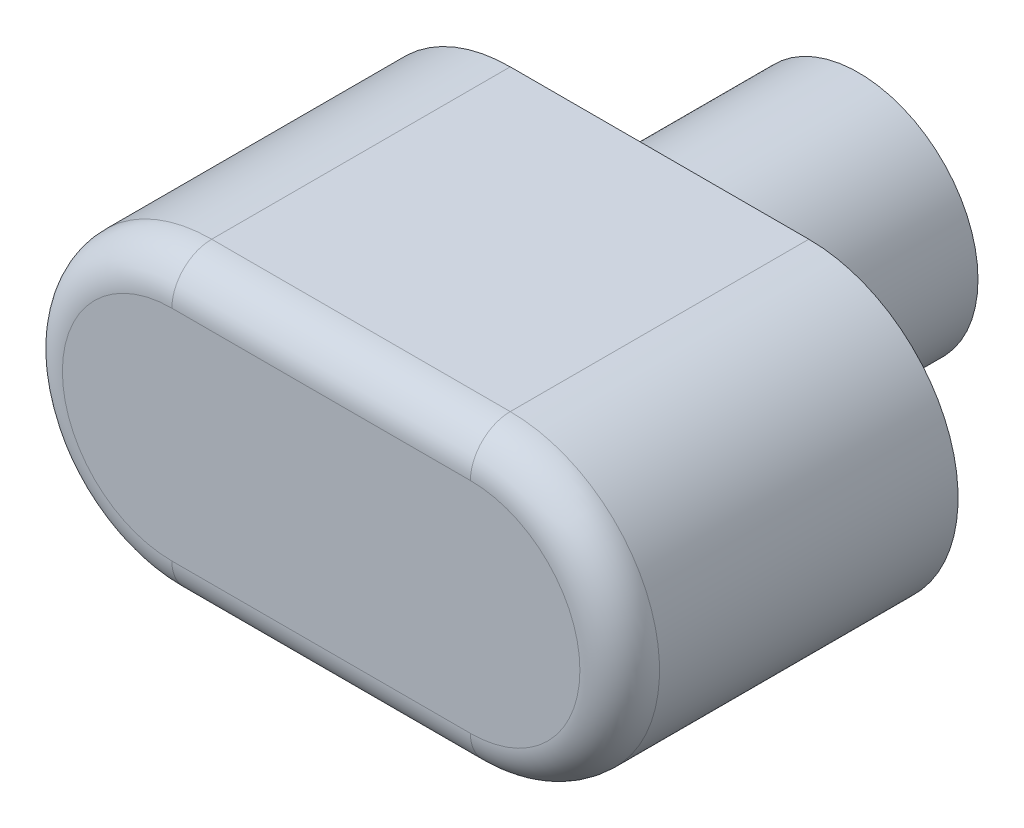
ISO-10303-21;
HEADER;
FILE_DESCRIPTION(('STEP AP214'),'2;1');
FILE_NAME('part.step','',(''),(''),'','','');
FILE_SCHEMA(('AUTOMOTIVE_DESIGN { 1 0 10303 214 1 1 1 1 }'));
ENDSEC;
DATA;
#1=APPLICATION_CONTEXT('core data for automotive mechanical design processes');
#2=APPLICATION_PROTOCOL_DEFINITION('international standard','automotive_design',2000,#1);
#3=PRODUCT_CONTEXT('',#1,'mechanical');
#4=PRODUCT('Part','Part','',(#3));
#5=PRODUCT_RELATED_PRODUCT_CATEGORY('part','',(#4));
#6=PRODUCT_DEFINITION_FORMATION('','',#4);
#7=PRODUCT_DEFINITION_CONTEXT('part definition',#1,'design');
#8=PRODUCT_DEFINITION('design','',#6,#7);
#9=PRODUCT_DEFINITION_SHAPE('','',#8);
#10=(LENGTH_UNIT() NAMED_UNIT(*) SI_UNIT(.MILLI.,.METRE.));
#11=(NAMED_UNIT(*) PLANE_ANGLE_UNIT() SI_UNIT($,.RADIAN.));
#12=(NAMED_UNIT(*) SI_UNIT($,.STERADIAN.) SOLID_ANGLE_UNIT());
#13=UNCERTAINTY_MEASURE_WITH_UNIT(LENGTH_MEASURE(1.E-05),#10,'distance_accuracy_value','');
#14=(GEOMETRIC_REPRESENTATION_CONTEXT(3) GLOBAL_UNCERTAINTY_ASSIGNED_CONTEXT((#13)) GLOBAL_UNIT_ASSIGNED_CONTEXT((#10,
#11,#12)) REPRESENTATION_CONTEXT('',''));
#15=CARTESIAN_POINT('',(0.,0.,0.));
#16=DIRECTION('',(0.,0.,1.));
#17=DIRECTION('',(1.,0.,0.));
#18=AXIS2_PLACEMENT_3D('',#15,#16,#17);
#19=CARTESIAN_POINT('',(-7.5,7.5,17.));
#20=DIRECTION('',(0.,0.,1.));
#21=DIRECTION('',(1.,0.,0.));
#22=AXIS2_PLACEMENT_3D('',#19,#20,#21);
#23=PLANE('',#22);
#24=DIRECTION('',(1.,0.,0.));
#25=VECTOR('',#24,1.);
#26=CARTESIAN_POINT('',(-11.25,13.,17.));
#27=LINE('',#26,#25);
#28=CARTESIAN_POINT('',(-15.,13.,17.));
#29=VERTEX_POINT('',#28);
#30=CARTESIAN_POINT('',(0.,13.,17.));
#31=VERTEX_POINT('',#30);
#32=EDGE_CURVE('E84',#29,#31,#27,.T.);
#33=ORIENTED_EDGE('',*,*,#32,.F.);
#34=CARTESIAN_POINT('',(-15.,7.5,17.));
#35=DIRECTION('',(0.,0.,-1.));
#36=DIRECTION('',(0.,-1.,0.));
#37=AXIS2_PLACEMENT_3D('',#34,#35,#36);
#38=CIRCLE('',#37,5.5);
#39=CARTESIAN_POINT('',(-15.,2.,17.));
#40=VERTEX_POINT('',#39);
#41=EDGE_CURVE('E104',#40,#29,#38,.T.);
#42=ORIENTED_EDGE('',*,*,#41,.F.);
#43=DIRECTION('',(-1.,0.,0.));
#44=VECTOR('',#43,1.);
#45=CARTESIAN_POINT('',(-3.75,2.,17.));
#46=LINE('',#45,#44);
#47=CARTESIAN_POINT('',(0.,2.,17.));
#48=VERTEX_POINT('',#47);
#49=EDGE_CURVE('E87',#48,#40,#46,.T.);
#50=ORIENTED_EDGE('',*,*,#49,.F.);
#51=CARTESIAN_POINT('',(0.,7.5,17.));
#52=DIRECTION('',(0.,0.,-1.));
#53=DIRECTION('',(0.,1.,0.));
#54=AXIS2_PLACEMENT_3D('',#51,#52,#53);
#55=CIRCLE('',#54,5.5);
#56=EDGE_CURVE('E80',#31,#48,#55,.T.);
#57=ORIENTED_EDGE('',*,*,#56,.F.);
#58=EDGE_LOOP('',(#33,#42,#50,#57));
#59=FACE_BOUND('',#58,.T.);
#60=ADVANCED_FACE('F17',(#59),#23,.T.);
#61=CARTESIAN_POINT('',(0.,7.5,15.));
#62=DIRECTION('',(0.,0.,-1.));
#63=DIRECTION('',(-1.,0.,0.));
#64=AXIS2_PLACEMENT_3D('',#61,#62,#63);
#65=TOROIDAL_SURFACE('',#64,5.5,2.);
#66=CARTESIAN_POINT('',(0.,2.,15.));
#67=DIRECTION('',(-1.,0.,0.));
#68=DIRECTION('',(0.,-1.,0.));
#69=AXIS2_PLACEMENT_3D('',#66,#67,#68);
#70=CIRCLE('',#69,2.);
#71=CARTESIAN_POINT('',(0.,0.,15.));
#72=VERTEX_POINT('',#71);
#73=EDGE_CURVE('E131',#72,#48,#70,.T.);
#74=ORIENTED_EDGE('',*,*,#73,.F.);
#75=CARTESIAN_POINT('',(0.,7.5,15.));
#76=DIRECTION('',(0.,0.,1.));
#77=DIRECTION('',(1.,0.,0.));
#78=AXIS2_PLACEMENT_3D('',#75,#76,#77);
#79=CIRCLE('',#78,7.5);
#80=CARTESIAN_POINT('',(0.,15.,15.));
#81=VERTEX_POINT('',#80);
#82=EDGE_CURVE('E96',#81,#72,#79,.F.);
#83=ORIENTED_EDGE('',*,*,#82,.F.);
#84=CARTESIAN_POINT('',(0.,13.,15.));
#85=DIRECTION('',(1.,0.,0.));
#86=DIRECTION('',(0.,0.,-1.));
#87=AXIS2_PLACEMENT_3D('',#84,#85,#86);
#88=CIRCLE('',#87,2.);
#89=EDGE_CURVE('E91',#31,#81,#88,.F.);
#90=ORIENTED_EDGE('',*,*,#89,.F.);
#91=ORIENTED_EDGE('',*,*,#56,.T.);
#92=EDGE_LOOP('',(#74,#83,#90,#91));
#93=FACE_BOUND('',#92,.T.);
#94=ADVANCED_FACE('F95',(#93),#65,.T.);
#95=CARTESIAN_POINT('',(-11.25,13.,15.));
#96=DIRECTION('',(1.,0.,0.));
#97=DIRECTION('',(0.,0.,-1.));
#98=AXIS2_PLACEMENT_3D('',#95,#96,#97);
#99=CYLINDRICAL_SURFACE('',#98,2.);
#100=CARTESIAN_POINT('',(-15.,13.,15.));
#101=DIRECTION('',(1.,0.,0.));
#102=DIRECTION('',(0.,1.,0.));
#103=AXIS2_PLACEMENT_3D('',#100,#101,#102);
#104=CIRCLE('',#103,2.);
#105=CARTESIAN_POINT('',(-15.,15.,15.));
#106=VERTEX_POINT('',#105);
#107=EDGE_CURVE('E101',#29,#106,#104,.F.);
#108=ORIENTED_EDGE('',*,*,#107,.F.);
#109=ORIENTED_EDGE('',*,*,#32,.T.);
#110=ORIENTED_EDGE('',*,*,#89,.T.);
#111=DIRECTION('',(1.,0.,0.));
#112=VECTOR('',#111,1.);
#113=CARTESIAN_POINT('',(-15.,15.,15.));
#114=LINE('',#113,#112);
#115=EDGE_CURVE('E145',#106,#81,#114,.T.);
#116=ORIENTED_EDGE('',*,*,#115,.F.);
#117=EDGE_LOOP('',(#108,#109,#110,#116));
#118=FACE_BOUND('',#117,.T.);
#119=ADVANCED_FACE('F100',(#118),#99,.T.);
#120=CARTESIAN_POINT('',(-15.,7.5,15.));
#121=DIRECTION('',(0.,0.,-1.));
#122=DIRECTION('',(-1.,0.,0.));
#123=AXIS2_PLACEMENT_3D('',#120,#121,#122);
#124=TOROIDAL_SURFACE('',#123,5.5,2.);
#125=CARTESIAN_POINT('',(-15.,2.,15.));
#126=DIRECTION('',(-1.,0.,0.));
#127=DIRECTION('',(0.,-1.,0.));
#128=AXIS2_PLACEMENT_3D('',#125,#126,#127);
#129=CIRCLE('',#128,2.);
#130=CARTESIAN_POINT('',(-15.,0.,15.));
#131=VERTEX_POINT('',#130);
#132=EDGE_CURVE('E130',#40,#131,#129,.F.);
#133=ORIENTED_EDGE('',*,*,#132,.F.);
#134=ORIENTED_EDGE('',*,*,#41,.T.);
#135=ORIENTED_EDGE('',*,*,#107,.T.);
#136=CARTESIAN_POINT('',(-15.,7.5,15.));
#137=DIRECTION('',(0.,0.,1.));
#138=DIRECTION('',(1.,0.,0.));
#139=AXIS2_PLACEMENT_3D('',#136,#137,#138);
#140=CIRCLE('',#139,7.5);
#141=EDGE_CURVE('E57',#131,#106,#140,.F.);
#142=ORIENTED_EDGE('',*,*,#141,.F.);
#143=EDGE_LOOP('',(#133,#134,#135,#142));
#144=FACE_BOUND('',#143,.T.);
#145=ADVANCED_FACE('F153',(#144),#124,.T.);
#146=CARTESIAN_POINT('',(-3.75,2.,15.));
#147=DIRECTION('',(-1.,0.,0.));
#148=DIRECTION('',(0.,-1.,0.));
#149=AXIS2_PLACEMENT_3D('',#146,#147,#148);
#150=CYLINDRICAL_SURFACE('',#149,2.);
#151=ORIENTED_EDGE('',*,*,#132,.T.);
#152=DIRECTION('',(1.,0.,0.));
#153=VECTOR('',#152,1.);
#154=CARTESIAN_POINT('',(0.,0.,15.));
#155=LINE('',#154,#153);
#156=EDGE_CURVE('E202',#72,#131,#155,.F.);
#157=ORIENTED_EDGE('',*,*,#156,.F.);
#158=ORIENTED_EDGE('',*,*,#73,.T.);
#159=ORIENTED_EDGE('',*,*,#49,.T.);
#160=EDGE_LOOP('',(#151,#157,#158,#159));
#161=FACE_BOUND('',#160,.T.);
#162=ADVANCED_FACE('F157',(#161),#150,.T.);
#163=CARTESIAN_POINT('',(0.,7.5,0.));
#164=DIRECTION('',(0.,0.,1.));
#165=DIRECTION('',(1.,0.,0.));
#166=AXIS2_PLACEMENT_3D('',#163,#164,#165);
#167=CYLINDRICAL_SURFACE('',#166,7.5);
#168=CARTESIAN_POINT('',(0.,7.5,0.));
#169=DIRECTION('',(0.,0.,1.));
#170=DIRECTION('',(1.,0.,0.));
#171=AXIS2_PLACEMENT_3D('',#168,#169,#170);
#172=CIRCLE('',#171,7.5);
#173=CARTESIAN_POINT('',(0.,0.,0.));
#174=VERTEX_POINT('',#173);
#175=CARTESIAN_POINT('',(0.,15.,0.));
#176=VERTEX_POINT('',#175);
#177=EDGE_CURVE('E21',#174,#176,#172,.T.);
#178=ORIENTED_EDGE('',*,*,#177,.T.);
#179=DIRECTION('',(0.,0.,1.));
#180=VECTOR('',#179,1.);
#181=CARTESIAN_POINT('',(0.,15.,0.));
#182=LINE('',#181,#180);
#183=EDGE_CURVE('E148',#81,#176,#182,.F.);
#184=ORIENTED_EDGE('',*,*,#183,.F.);
#185=ORIENTED_EDGE('',*,*,#82,.T.);
#186=DIRECTION('',(0.,0.,-1.));
#187=VECTOR('',#186,1.);
#188=CARTESIAN_POINT('',(0.,0.,0.));
#189=LINE('',#188,#187);
#190=EDGE_CURVE('E48',#174,#72,#189,.F.);
#191=ORIENTED_EDGE('',*,*,#190,.F.);
#192=EDGE_LOOP('',(#178,#184,#185,#191));
#193=FACE_BOUND('',#192,.T.);
#194=ADVANCED_FACE('F160',(#193),#167,.T.);
#195=CARTESIAN_POINT('',(-15.,15.,0.));
#196=DIRECTION('',(0.,1.,0.));
#197=DIRECTION('',(0.,0.,1.));
#198=AXIS2_PLACEMENT_3D('',#195,#196,#197);
#199=PLANE('',#198);
#200=DIRECTION('',(1.,0.,0.));
#201=VECTOR('',#200,1.);
#202=CARTESIAN_POINT('',(-7.5,15.,0.));
#203=LINE('',#202,#201);
#204=CARTESIAN_POINT('',(-15.,15.,0.));
#205=VERTEX_POINT('',#204);
#206=EDGE_CURVE('E194',#176,#205,#203,.F.);
#207=ORIENTED_EDGE('',*,*,#206,.T.);
#208=DIRECTION('',(0.,0.,1.));
#209=VECTOR('',#208,1.);
#210=CARTESIAN_POINT('',(-15.,15.,0.));
#211=LINE('',#210,#209);
#212=EDGE_CURVE('E208',#106,#205,#211,.F.);
#213=ORIENTED_EDGE('',*,*,#212,.F.);
#214=ORIENTED_EDGE('',*,*,#115,.T.);
#215=ORIENTED_EDGE('',*,*,#183,.T.);
#216=EDGE_LOOP('',(#207,#213,#214,#215));
#217=FACE_BOUND('',#216,.T.);
#218=ADVANCED_FACE('F163',(#217),#199,.T.);
#219=CARTESIAN_POINT('',(-15.,7.5,0.));
#220=DIRECTION('',(0.,0.,1.));
#221=DIRECTION('',(1.,0.,0.));
#222=AXIS2_PLACEMENT_3D('',#219,#220,#221);
#223=CYLINDRICAL_SURFACE('',#222,7.5);
#224=CARTESIAN_POINT('',(-15.,7.5,0.));
#225=DIRECTION('',(0.,0.,1.));
#226=DIRECTION('',(1.,0.,0.));
#227=AXIS2_PLACEMENT_3D('',#224,#225,#226);
#228=CIRCLE('',#227,7.5);
#229=CARTESIAN_POINT('',(-15.,0.,0.));
#230=VERTEX_POINT('',#229);
#231=EDGE_CURVE('E36',#205,#230,#228,.T.);
#232=ORIENTED_EDGE('',*,*,#231,.T.);
#233=DIRECTION('',(0.,0.,-1.));
#234=VECTOR('',#233,1.);
#235=CARTESIAN_POINT('',(-15.,0.,0.));
#236=LINE('',#235,#234);
#237=EDGE_CURVE('E200',#131,#230,#236,.T.);
#238=ORIENTED_EDGE('',*,*,#237,.F.);
#239=ORIENTED_EDGE('',*,*,#141,.T.);
#240=ORIENTED_EDGE('',*,*,#212,.T.);
#241=EDGE_LOOP('',(#232,#238,#239,#240));
#242=FACE_BOUND('',#241,.T.);
#243=ADVANCED_FACE('F166',(#242),#223,.T.);
#244=CARTESIAN_POINT('',(0.,0.,0.));
#245=DIRECTION('',(0.,-1.,0.));
#246=DIRECTION('',(0.,0.,-1.));
#247=AXIS2_PLACEMENT_3D('',#244,#245,#246);
#248=PLANE('',#247);
#249=DIRECTION('',(1.,0.,0.));
#250=VECTOR('',#249,1.);
#251=CARTESIAN_POINT('',(-7.5,0.,0.));
#252=LINE('',#251,#250);
#253=EDGE_CURVE('E192',#230,#174,#252,.T.);
#254=ORIENTED_EDGE('',*,*,#253,.T.);
#255=ORIENTED_EDGE('',*,*,#190,.T.);
#256=ORIENTED_EDGE('',*,*,#156,.T.);
#257=ORIENTED_EDGE('',*,*,#237,.T.);
#258=EDGE_LOOP('',(#254,#255,#256,#257));
#259=FACE_BOUND('',#258,.T.);
#260=ADVANCED_FACE('F170',(#259),#248,.T.);
#261=CARTESIAN_POINT('',(-7.5,7.5,-10.));
#262=DIRECTION('',(0.,0.,1.));
#263=DIRECTION('',(1.,0.,0.));
#264=AXIS2_PLACEMENT_3D('',#261,#262,#263);
#265=PLANE('',#264);
#266=CARTESIAN_POINT('',(-7.5,7.5,-10.));
#267=DIRECTION('',(0.,0.,-1.));
#268=DIRECTION('',(-1.,0.,0.));
#269=AXIS2_PLACEMENT_3D('',#266,#267,#268);
#270=CIRCLE('',#269,6.);
#271=CARTESIAN_POINT('',(-13.5,7.5,-10.));
#272=VERTEX_POINT('',#271);
#273=EDGE_CURVE('E27',#272,#272,#270,.F.);
#274=ORIENTED_EDGE('',*,*,#273,.F.);
#275=EDGE_LOOP('',(#274));
#276=FACE_BOUND('',#275,.T.);
#277=ADVANCED_FACE('F173',(#276),#265,.F.);
#278=CARTESIAN_POINT('',(-7.5,7.5,0.));
#279=DIRECTION('',(0.,0.,1.));
#280=DIRECTION('',(1.,0.,0.));
#281=AXIS2_PLACEMENT_3D('',#278,#279,#280);
#282=PLANE('',#281);
#283=CARTESIAN_POINT('',(-7.5,7.5,0.));
#284=DIRECTION('',(0.,0.,-1.));
#285=DIRECTION('',(-1.,0.,0.));
#286=AXIS2_PLACEMENT_3D('',#283,#284,#285);
#287=CIRCLE('',#286,6.);
#288=CARTESIAN_POINT('',(-13.5,7.5,0.));
#289=VERTEX_POINT('',#288);
#290=EDGE_CURVE('E11',#289,#289,#287,.T.);
#291=ORIENTED_EDGE('',*,*,#290,.F.);
#292=EDGE_LOOP('',(#291));
#293=FACE_BOUND('',#292,.T.);
#294=ORIENTED_EDGE('',*,*,#231,.F.);
#295=ORIENTED_EDGE('',*,*,#206,.F.);
#296=ORIENTED_EDGE('',*,*,#177,.F.);
#297=ORIENTED_EDGE('',*,*,#253,.F.);
#298=EDGE_LOOP('',(#294,#295,#296,#297));
#299=FACE_BOUND('',#298,.T.);
#300=ADVANCED_FACE('F177',(#293,#299),#282,.F.);
#301=CARTESIAN_POINT('',(-7.5,7.5,0.));
#302=DIRECTION('',(0.,0.,-1.));
#303=DIRECTION('',(-1.,0.,0.));
#304=AXIS2_PLACEMENT_3D('',#301,#302,#303);
#305=CYLINDRICAL_SURFACE('',#304,6.);
#306=ORIENTED_EDGE('',*,*,#290,.T.);
#307=EDGE_LOOP('',(#306));
#308=FACE_BOUND('',#307,.T.);
#309=ORIENTED_EDGE('',*,*,#273,.T.);
#310=EDGE_LOOP('',(#309));
#311=FACE_BOUND('',#310,.T.);
#312=ADVANCED_FACE('F181',(#308,#311),#305,.T.);
#313=CLOSED_SHELL('',(#60,#94,#119,#145,#162,#194,#218,#243,#260,#277,#300,#312));
#314=MANIFOLD_SOLID_BREP('B1',#313);
#315=ADVANCED_BREP_SHAPE_REPRESENTATION('',(#18,#314),#14);
#316=SHAPE_DEFINITION_REPRESENTATION(#9,#315);
ENDSEC;
END-ISO-10303-21;
